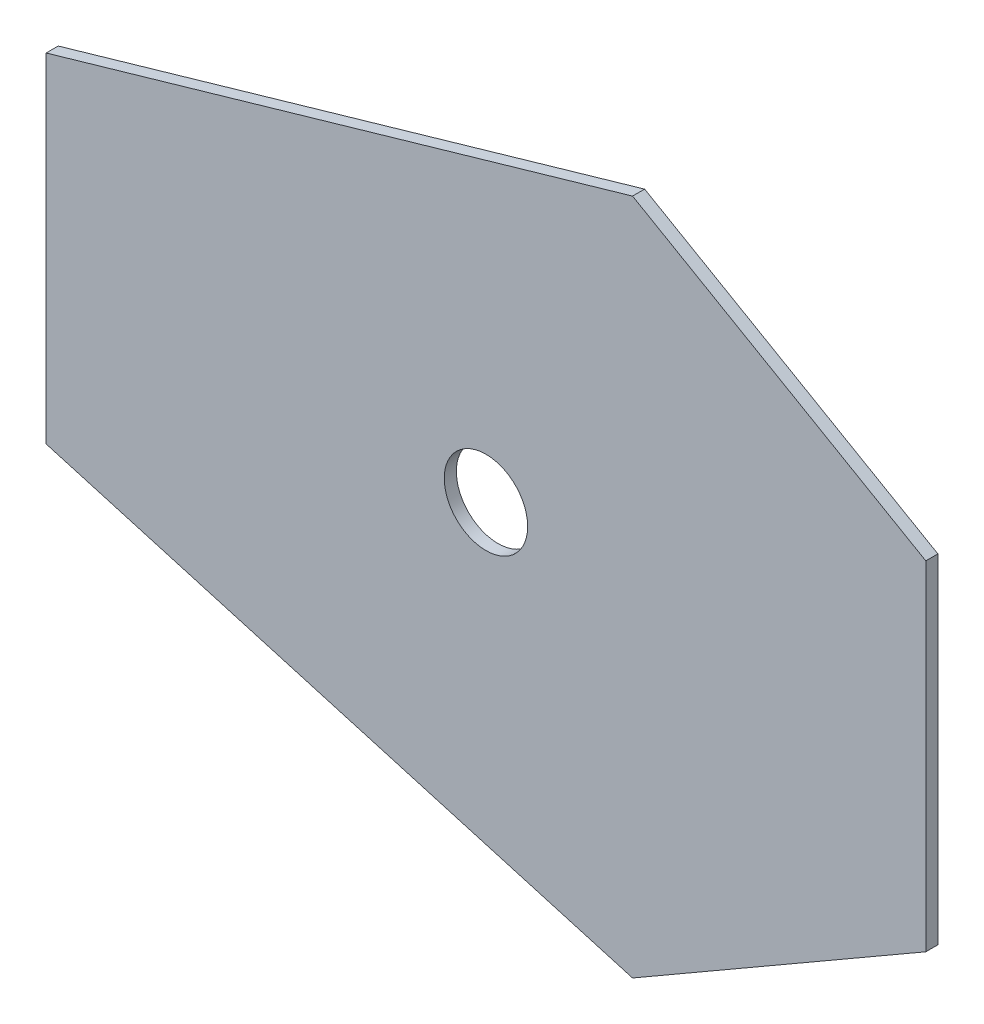
ISO-10303-21;
HEADER;
FILE_DESCRIPTION(('STEP AP214'),'2;1');
FILE_NAME('part.step','',(''),(''),'','','');
FILE_SCHEMA(('AUTOMOTIVE_DESIGN { 1 0 10303 214 1 1 1 1 }'));
ENDSEC;
DATA;
#1=APPLICATION_CONTEXT('core data for automotive mechanical design processes');
#2=APPLICATION_PROTOCOL_DEFINITION('international standard','automotive_design',2000,#1);
#3=PRODUCT_CONTEXT('',#1,'mechanical');
#4=PRODUCT('Part','Part','',(#3));
#5=PRODUCT_RELATED_PRODUCT_CATEGORY('part','',(#4));
#6=PRODUCT_DEFINITION_FORMATION('','',#4);
#7=PRODUCT_DEFINITION_CONTEXT('part definition',#1,'design');
#8=PRODUCT_DEFINITION('design','',#6,#7);
#9=PRODUCT_DEFINITION_SHAPE('','',#8);
#10=(LENGTH_UNIT() NAMED_UNIT(*) SI_UNIT(.MILLI.,.METRE.));
#11=(NAMED_UNIT(*) PLANE_ANGLE_UNIT() SI_UNIT($,.RADIAN.));
#12=(NAMED_UNIT(*) SI_UNIT($,.STERADIAN.) SOLID_ANGLE_UNIT());
#13=UNCERTAINTY_MEASURE_WITH_UNIT(LENGTH_MEASURE(1.E-05),#10,'distance_accuracy_value','');
#14=(GEOMETRIC_REPRESENTATION_CONTEXT(3) GLOBAL_UNCERTAINTY_ASSIGNED_CONTEXT((#13)) GLOBAL_UNIT_ASSIGNED_CONTEXT((#10,
#11,#12)) REPRESENTATION_CONTEXT('',''));
#15=CARTESIAN_POINT('',(0.,0.,0.));
#16=DIRECTION('',(0.,0.,1.));
#17=DIRECTION('',(1.,0.,0.));
#18=AXIS2_PLACEMENT_3D('',#15,#16,#17);
#19=CARTESIAN_POINT('',(0.,0.,1.));
#20=DIRECTION('',(0.,0.,1.));
#21=DIRECTION('',(1.,0.,0.));
#22=AXIS2_PLACEMENT_3D('',#19,#20,#21);
#23=PLANE('',#22);
#24=DIRECTION('',(0.,-1.,0.));
#25=VECTOR('',#24,1.);
#26=CARTESIAN_POINT('',(-41.5230669589465,14.,1.));
#27=LINE('',#26,#25);
#28=CARTESIAN_POINT('',(-41.5230669589465,14.,1.));
#29=VERTEX_POINT('',#28);
#30=CARTESIAN_POINT('',(-41.5230669589465,-14.,1.));
#31=VERTEX_POINT('',#30);
#32=EDGE_CURVE('E129',#29,#31,#27,.T.);
#33=ORIENTED_EDGE('',*,*,#32,.T.);
#34=DIRECTION('',(0.960768922830523,-0.277350098112614,0.));
#35=VECTOR('',#34,1.);
#36=CARTESIAN_POINT('',(-41.5230669589465,-14.,1.));
#37=LINE('',#36,#35);
#38=CARTESIAN_POINT('',(6.97435565298216,-28.,1.));
#39=VERTEX_POINT('',#38);
#40=EDGE_CURVE('E87',#31,#39,#37,.T.);
#41=ORIENTED_EDGE('',*,*,#40,.T.);
#42=DIRECTION('',(0.866025403784439,0.5,0.));
#43=VECTOR('',#42,1.);
#44=CARTESIAN_POINT('',(6.97435565298216,-28.,1.));
#45=LINE('',#44,#43);
#46=CARTESIAN_POINT('',(31.2230669589464,-14.,1.));
#47=VERTEX_POINT('',#46);
#48=EDGE_CURVE('E100',#39,#47,#45,.T.);
#49=ORIENTED_EDGE('',*,*,#48,.T.);
#50=DIRECTION('',(0.,1.,0.));
#51=VECTOR('',#50,1.);
#52=CARTESIAN_POINT('',(31.2230669589464,-14.,1.));
#53=LINE('',#52,#51);
#54=CARTESIAN_POINT('',(31.2230669589464,14.,1.));
#55=VERTEX_POINT('',#54);
#56=EDGE_CURVE('E94',#47,#55,#53,.T.);
#57=ORIENTED_EDGE('',*,*,#56,.T.);
#58=DIRECTION('',(-0.866025403784439,0.5,0.));
#59=VECTOR('',#58,1.);
#60=CARTESIAN_POINT('',(31.2230669589464,14.,1.));
#61=LINE('',#60,#59);
#62=CARTESIAN_POINT('',(6.97435565298216,28.,1.));
#63=VERTEX_POINT('',#62);
#64=EDGE_CURVE('E98',#55,#63,#61,.T.);
#65=ORIENTED_EDGE('',*,*,#64,.T.);
#66=DIRECTION('',(-0.960768922830523,-0.277350098112614,0.));
#67=VECTOR('',#66,1.);
#68=CARTESIAN_POINT('',(6.97435565298216,28.,1.));
#69=LINE('',#68,#67);
#70=EDGE_CURVE('E50',#63,#29,#69,.T.);
#71=ORIENTED_EDGE('',*,*,#70,.T.);
#72=EDGE_LOOP('',(#33,#41,#49,#57,#65,#71));
#73=FACE_BOUND('',#72,.T.);
#74=CARTESIAN_POINT('',(-5.15,0.,1.));
#75=DIRECTION('',(0.,0.,1.));
#76=DIRECTION('',(1.,0.,0.));
#77=AXIS2_PLACEMENT_3D('',#74,#75,#76);
#78=CIRCLE('',#77,3.45);
#79=CARTESIAN_POINT('',(-1.7,0.,1.));
#80=VERTEX_POINT('',#79);
#81=EDGE_CURVE('E122',#80,#80,#78,.T.);
#82=ORIENTED_EDGE('',*,*,#81,.F.);
#83=EDGE_LOOP('',(#82));
#84=FACE_BOUND('',#83,.T.);
#85=ADVANCED_FACE('F33',(#73,#84),#23,.T.);
#86=CARTESIAN_POINT('',(0.,0.,0.));
#87=DIRECTION('',(0.,0.,1.));
#88=DIRECTION('',(1.,0.,0.));
#89=AXIS2_PLACEMENT_3D('',#86,#87,#88);
#90=PLANE('',#89);
#91=DIRECTION('',(0.,-1.,0.));
#92=VECTOR('',#91,1.);
#93=CARTESIAN_POINT('',(-41.5230669589465,14.,0.));
#94=LINE('',#93,#92);
#95=CARTESIAN_POINT('',(-41.5230669589465,14.,0.));
#96=VERTEX_POINT('',#95);
#97=CARTESIAN_POINT('',(-41.5230669589465,-14.,0.));
#98=VERTEX_POINT('',#97);
#99=EDGE_CURVE('E118',#96,#98,#94,.T.);
#100=ORIENTED_EDGE('',*,*,#99,.F.);
#101=DIRECTION('',(-0.960768922830523,-0.277350098112614,0.));
#102=VECTOR('',#101,1.);
#103=CARTESIAN_POINT('',(6.97435565298216,28.,0.));
#104=LINE('',#103,#102);
#105=CARTESIAN_POINT('',(6.97435565298216,28.,0.));
#106=VERTEX_POINT('',#105);
#107=EDGE_CURVE('E79',#106,#96,#104,.T.);
#108=ORIENTED_EDGE('',*,*,#107,.F.);
#109=DIRECTION('',(-0.866025403784439,0.5,0.));
#110=VECTOR('',#109,1.);
#111=CARTESIAN_POINT('',(31.2230669589464,14.,0.));
#112=LINE('',#111,#110);
#113=CARTESIAN_POINT('',(31.2230669589464,14.,0.));
#114=VERTEX_POINT('',#113);
#115=EDGE_CURVE('E73',#114,#106,#112,.T.);
#116=ORIENTED_EDGE('',*,*,#115,.F.);
#117=DIRECTION('',(0.,1.,0.));
#118=VECTOR('',#117,1.);
#119=CARTESIAN_POINT('',(31.2230669589464,-14.,0.));
#120=LINE('',#119,#118);
#121=CARTESIAN_POINT('',(31.2230669589464,-14.,0.));
#122=VERTEX_POINT('',#121);
#123=EDGE_CURVE('E108',#122,#114,#120,.T.);
#124=ORIENTED_EDGE('',*,*,#123,.F.);
#125=DIRECTION('',(0.866025403784439,0.5,0.));
#126=VECTOR('',#125,1.);
#127=CARTESIAN_POINT('',(6.97435565298216,-28.,0.));
#128=LINE('',#127,#126);
#129=CARTESIAN_POINT('',(6.97435565298216,-28.,0.));
#130=VERTEX_POINT('',#129);
#131=EDGE_CURVE('E124',#130,#122,#128,.T.);
#132=ORIENTED_EDGE('',*,*,#131,.F.);
#133=DIRECTION('',(0.960768922830523,-0.277350098112614,0.));
#134=VECTOR('',#133,1.);
#135=CARTESIAN_POINT('',(-41.5230669589465,-14.,0.));
#136=LINE('',#135,#134);
#137=EDGE_CURVE('E121',#98,#130,#136,.T.);
#138=ORIENTED_EDGE('',*,*,#137,.F.);
#139=EDGE_LOOP('',(#100,#108,#116,#124,#132,#138));
#140=FACE_BOUND('',#139,.T.);
#141=CARTESIAN_POINT('',(-5.15,0.,0.));
#142=DIRECTION('',(0.,0.,1.));
#143=DIRECTION('',(1.,0.,0.));
#144=AXIS2_PLACEMENT_3D('',#141,#142,#143);
#145=CIRCLE('',#144,3.45);
#146=CARTESIAN_POINT('',(-1.7,0.,0.));
#147=VERTEX_POINT('',#146);
#148=EDGE_CURVE('E222',#147,#147,#145,.T.);
#149=ORIENTED_EDGE('',*,*,#148,.T.);
#150=EDGE_LOOP('',(#149));
#151=FACE_BOUND('',#150,.T.);
#152=ADVANCED_FACE('F138',(#140,#151),#90,.F.);
#153=CARTESIAN_POINT('',(-41.5230669589465,14.,1.));
#154=DIRECTION('',(1.,0.,0.));
#155=DIRECTION('',(0.,0.,-1.));
#156=AXIS2_PLACEMENT_3D('',#153,#154,#155);
#157=PLANE('',#156);
#158=ORIENTED_EDGE('',*,*,#99,.T.);
#159=DIRECTION('',(0.,0.,-1.));
#160=VECTOR('',#159,1.);
#161=CARTESIAN_POINT('',(-41.5230669589465,-14.,1.));
#162=LINE('',#161,#160);
#163=EDGE_CURVE('E11',#31,#98,#162,.T.);
#164=ORIENTED_EDGE('',*,*,#163,.F.);
#165=ORIENTED_EDGE('',*,*,#32,.F.);
#166=DIRECTION('',(0.,0.,-1.));
#167=VECTOR('',#166,1.);
#168=CARTESIAN_POINT('',(-41.5230669589465,14.,1.));
#169=LINE('',#168,#167);
#170=EDGE_CURVE('E114',#29,#96,#169,.T.);
#171=ORIENTED_EDGE('',*,*,#170,.T.);
#172=EDGE_LOOP('',(#158,#164,#165,#171));
#173=FACE_BOUND('',#172,.T.);
#174=ADVANCED_FACE('F35',(#173),#157,.F.);
#175=CARTESIAN_POINT('',(-41.5230669589465,-14.,1.));
#176=DIRECTION('',(0.277350098112614,0.960768922830523,0.));
#177=DIRECTION('',(-0.960768922830523,0.277350098112614,0.));
#178=AXIS2_PLACEMENT_3D('',#175,#176,#177);
#179=PLANE('',#178);
#180=ORIENTED_EDGE('',*,*,#137,.T.);
#181=DIRECTION('',(0.,0.,-1.));
#182=VECTOR('',#181,1.);
#183=CARTESIAN_POINT('',(6.97435565298216,-28.,1.));
#184=LINE('',#183,#182);
#185=EDGE_CURVE('E42',#39,#130,#184,.T.);
#186=ORIENTED_EDGE('',*,*,#185,.F.);
#187=ORIENTED_EDGE('',*,*,#40,.F.);
#188=ORIENTED_EDGE('',*,*,#163,.T.);
#189=EDGE_LOOP('',(#180,#186,#187,#188));
#190=FACE_BOUND('',#189,.T.);
#191=ADVANCED_FACE('F163',(#190),#179,.F.);
#192=CARTESIAN_POINT('',(6.97435565298216,-28.,1.));
#193=DIRECTION('',(-0.5,0.866025403784439,0.));
#194=DIRECTION('',(-0.866025403784439,-0.5,0.));
#195=AXIS2_PLACEMENT_3D('',#192,#193,#194);
#196=PLANE('',#195);
#197=ORIENTED_EDGE('',*,*,#131,.T.);
#198=DIRECTION('',(0.,0.,-1.));
#199=VECTOR('',#198,1.);
#200=CARTESIAN_POINT('',(31.2230669589464,-14.,1.));
#201=LINE('',#200,#199);
#202=EDGE_CURVE('E109',#47,#122,#201,.T.);
#203=ORIENTED_EDGE('',*,*,#202,.F.);
#204=ORIENTED_EDGE('',*,*,#48,.F.);
#205=ORIENTED_EDGE('',*,*,#185,.T.);
#206=EDGE_LOOP('',(#197,#203,#204,#205));
#207=FACE_BOUND('',#206,.T.);
#208=ADVANCED_FACE('F135',(#207),#196,.F.);
#209=CARTESIAN_POINT('',(31.2230669589464,-14.,1.));
#210=DIRECTION('',(-1.,0.,0.));
#211=DIRECTION('',(0.,0.,1.));
#212=AXIS2_PLACEMENT_3D('',#209,#210,#211);
#213=PLANE('',#212);
#214=ORIENTED_EDGE('',*,*,#123,.T.);
#215=DIRECTION('',(0.,0.,-1.));
#216=VECTOR('',#215,1.);
#217=CARTESIAN_POINT('',(31.2230669589464,14.,1.));
#218=LINE('',#217,#216);
#219=EDGE_CURVE('E105',#55,#114,#218,.T.);
#220=ORIENTED_EDGE('',*,*,#219,.F.);
#221=ORIENTED_EDGE('',*,*,#56,.F.);
#222=ORIENTED_EDGE('',*,*,#202,.T.);
#223=EDGE_LOOP('',(#214,#220,#221,#222));
#224=FACE_BOUND('',#223,.T.);
#225=ADVANCED_FACE('F106',(#224),#213,.F.);
#226=CARTESIAN_POINT('',(31.2230669589464,14.,1.));
#227=DIRECTION('',(-0.5,-0.866025403784439,0.));
#228=DIRECTION('',(0.866025403784439,-0.5,0.));
#229=AXIS2_PLACEMENT_3D('',#226,#227,#228);
#230=PLANE('',#229);
#231=ORIENTED_EDGE('',*,*,#115,.T.);
#232=DIRECTION('',(0.,0.,-1.));
#233=VECTOR('',#232,1.);
#234=CARTESIAN_POINT('',(6.97435565298216,28.,1.));
#235=LINE('',#234,#233);
#236=EDGE_CURVE('E110',#63,#106,#235,.T.);
#237=ORIENTED_EDGE('',*,*,#236,.F.);
#238=ORIENTED_EDGE('',*,*,#64,.F.);
#239=ORIENTED_EDGE('',*,*,#219,.T.);
#240=EDGE_LOOP('',(#231,#237,#238,#239));
#241=FACE_BOUND('',#240,.T.);
#242=ADVANCED_FACE('F112',(#241),#230,.F.);
#243=CARTESIAN_POINT('',(6.97435565298216,28.,1.));
#244=DIRECTION('',(0.277350098112614,-0.960768922830523,0.));
#245=DIRECTION('',(0.960768922830523,0.277350098112614,0.));
#246=AXIS2_PLACEMENT_3D('',#243,#244,#245);
#247=PLANE('',#246);
#248=ORIENTED_EDGE('',*,*,#107,.T.);
#249=ORIENTED_EDGE('',*,*,#170,.F.);
#250=ORIENTED_EDGE('',*,*,#70,.F.);
#251=ORIENTED_EDGE('',*,*,#236,.T.);
#252=EDGE_LOOP('',(#248,#249,#250,#251));
#253=FACE_BOUND('',#252,.T.);
#254=ADVANCED_FACE('F143',(#253),#247,.F.);
#255=CARTESIAN_POINT('',(-5.15,0.,1.));
#256=DIRECTION('',(0.,0.,-1.));
#257=DIRECTION('',(-1.,0.,0.));
#258=AXIS2_PLACEMENT_3D('',#255,#256,#257);
#259=CYLINDRICAL_SURFACE('',#258,3.45);
#260=ORIENTED_EDGE('',*,*,#81,.T.);
#261=EDGE_LOOP('',(#260));
#262=FACE_BOUND('',#261,.T.);
#263=ORIENTED_EDGE('',*,*,#148,.F.);
#264=EDGE_LOOP('',(#263));
#265=FACE_BOUND('',#264,.T.);
#266=ADVANCED_FACE('F145',(#262,#265),#259,.F.);
#267=CLOSED_SHELL('',(#85,#152,#174,#191,#208,#225,#242,#254,#266));
#268=MANIFOLD_SOLID_BREP('B2',#267);
#269=ADVANCED_BREP_SHAPE_REPRESENTATION('',(#18,#268),#14);
#270=SHAPE_DEFINITION_REPRESENTATION(#9,#269);
ENDSEC;
END-ISO-10303-21;
